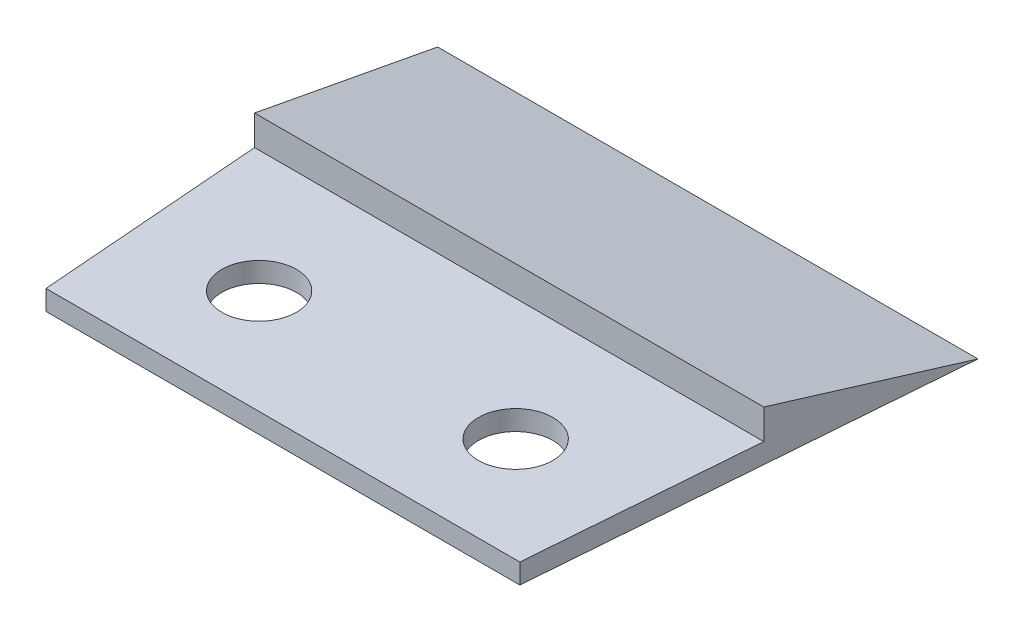
ISO-10303-21;
HEADER;
FILE_DESCRIPTION(('STEP AP214'),'2;1');
FILE_NAME('part.step','',(''),(''),'','','');
FILE_SCHEMA(('AUTOMOTIVE_DESIGN { 1 0 10303 214 1 1 1 1 }'));
ENDSEC;
DATA;
#1=APPLICATION_CONTEXT('core data for automotive mechanical design processes');
#2=APPLICATION_PROTOCOL_DEFINITION('international standard','automotive_design',2000,#1);
#3=PRODUCT_CONTEXT('',#1,'mechanical');
#4=PRODUCT('Part','Part','',(#3));
#5=PRODUCT_RELATED_PRODUCT_CATEGORY('part','',(#4));
#6=PRODUCT_DEFINITION_FORMATION('','',#4);
#7=PRODUCT_DEFINITION_CONTEXT('part definition',#1,'design');
#8=PRODUCT_DEFINITION('design','',#6,#7);
#9=PRODUCT_DEFINITION_SHAPE('','',#8);
#10=(LENGTH_UNIT() NAMED_UNIT(*) SI_UNIT(.MILLI.,.METRE.));
#11=(NAMED_UNIT(*) PLANE_ANGLE_UNIT() SI_UNIT($,.RADIAN.));
#12=(NAMED_UNIT(*) SI_UNIT($,.STERADIAN.) SOLID_ANGLE_UNIT());
#13=UNCERTAINTY_MEASURE_WITH_UNIT(LENGTH_MEASURE(1.E-05),#10,'distance_accuracy_value','');
#14=(GEOMETRIC_REPRESENTATION_CONTEXT(3) GLOBAL_UNCERTAINTY_ASSIGNED_CONTEXT((#13)) GLOBAL_UNIT_ASSIGNED_CONTEXT((#10,
#11,#12)) REPRESENTATION_CONTEXT('',''));
#15=CARTESIAN_POINT('',(0.,0.,0.));
#16=DIRECTION('',(0.,0.,1.));
#17=DIRECTION('',(1.,0.,0.));
#18=AXIS2_PLACEMENT_3D('',#15,#16,#17);
#19=CARTESIAN_POINT('',(0.,1.524,0.));
#20=DIRECTION('',(0.,1.,0.));
#21=DIRECTION('',(0.,0.,1.));
#22=AXIS2_PLACEMENT_3D('',#19,#20,#21);
#23=PLANE('',#22);
#24=CARTESIAN_POINT('',(10.1883307692308,1.524,12.4112215384615));
#25=DIRECTION('',(0.,1.,0.));
#26=DIRECTION('',(0.,0.,1.));
#27=AXIS2_PLACEMENT_3D('',#24,#25,#26);
#28=CIRCLE('',#27,2.8448);
#29=CARTESIAN_POINT('',(10.1883307692308,1.524,9.56642153846154));
#30=VERTEX_POINT('',#29);
#31=EDGE_CURVE('E113',#30,#30,#28,.F.);
#32=ORIENTED_EDGE('',*,*,#31,.T.);
#33=EDGE_LOOP('',(#32));
#34=FACE_BOUND('',#33,.T.);
#35=CARTESIAN_POINT('',(-9.39506923076923,1.524,12.4112215384615));
#36=DIRECTION('',(0.,1.,0.));
#37=DIRECTION('',(0.,0.,1.));
#38=AXIS2_PLACEMENT_3D('',#35,#36,#37);
#39=CIRCLE('',#38,2.8448);
#40=CARTESIAN_POINT('',(-9.39506923076923,1.524,9.56642153846154));
#41=VERTEX_POINT('',#40);
#42=EDGE_CURVE('E114',#41,#41,#39,.T.);
#43=ORIENTED_EDGE('',*,*,#42,.F.);
#44=EDGE_LOOP('',(#43));
#45=FACE_BOUND('',#44,.T.);
#46=DIRECTION('',(0.0780695314427082,0.,-0.996947916523384));
#47=VECTOR('',#46,1.);
#48=CARTESIAN_POINT('',(19.9555211295336,1.524,1.56268763739495));
#49=LINE('',#48,#47);
#50=CARTESIAN_POINT('',(18.4814307692308,1.524,20.3868215384615));
#51=VERTEX_POINT('',#50);
#52=CARTESIAN_POINT('',(19.8339757966388,1.524,3.11482153846154));
#53=VERTEX_POINT('',#52);
#54=EDGE_CURVE('E56',#51,#53,#49,.T.);
#55=ORIENTED_EDGE('',*,*,#54,.T.);
#56=DIRECTION('',(-1.,0.,0.));
#57=VECTOR('',#56,1.);
#58=CARTESIAN_POINT('',(29.5856431202425,1.524,3.11482153846154));
#59=LINE('',#58,#57);
#60=CARTESIAN_POINT('',(-19.0407142581772,1.524,3.11482153846154));
#61=VERTEX_POINT('',#60);
#62=EDGE_CURVE('E51',#53,#61,#59,.T.);
#63=ORIENTED_EDGE('',*,*,#62,.T.);
#64=DIRECTION('',(-0.0780695314427085,0.,-0.996947916523384));
#65=VECTOR('',#64,1.);
#66=CARTESIAN_POINT('',(-19.1670944025397,1.524,1.50094709495222));
#67=LINE('',#66,#65);
#68=CARTESIAN_POINT('',(-17.6881692307692,1.524,20.3868215384615));
#69=VERTEX_POINT('',#68);
#70=EDGE_CURVE('E118',#69,#61,#67,.T.);
#71=ORIENTED_EDGE('',*,*,#70,.F.);
#72=DIRECTION('',(1.,0.,0.));
#73=VECTOR('',#72,1.);
#74=CARTESIAN_POINT('',(0.,1.524,20.3868215384615));
#75=LINE('',#74,#73);
#76=EDGE_CURVE('E142',#69,#51,#75,.T.);
#77=ORIENTED_EDGE('',*,*,#76,.T.);
#78=EDGE_LOOP('',(#55,#63,#71,#77));
#79=FACE_BOUND('',#78,.T.);
#80=ADVANCED_FACE('F36',(#34,#45,#79),#23,.T.);
#81=CARTESIAN_POINT('',(0.,1.524,20.3868215384615));
#82=DIRECTION('',(0.,0.,-1.));
#83=DIRECTION('',(-1.,0.,0.));
#84=AXIS2_PLACEMENT_3D('',#81,#82,#83);
#85=PLANE('',#84);
#86=DIRECTION('',(1.,0.,0.));
#87=VECTOR('',#86,1.);
#88=CARTESIAN_POINT('',(0.,0.,20.3868215384615));
#89=LINE('',#88,#87);
#90=CARTESIAN_POINT('',(-17.6881692307692,0.,20.3868215384615));
#91=VERTEX_POINT('',#90);
#92=CARTESIAN_POINT('',(18.4814307692308,0.,20.3868215384615));
#93=VERTEX_POINT('',#92);
#94=EDGE_CURVE('E101',#91,#93,#89,.T.);
#95=ORIENTED_EDGE('',*,*,#94,.T.);
#96=DIRECTION('',(0.,-1.,0.));
#97=VECTOR('',#96,1.);
#98=CARTESIAN_POINT('',(18.4814307692308,1.524,20.3868215384615));
#99=LINE('',#98,#97);
#100=EDGE_CURVE('E12',#51,#93,#99,.T.);
#101=ORIENTED_EDGE('',*,*,#100,.F.);
#102=ORIENTED_EDGE('',*,*,#76,.F.);
#103=DIRECTION('',(0.,-1.,0.));
#104=VECTOR('',#103,1.);
#105=CARTESIAN_POINT('',(-17.6881692307692,1.524,20.3868215384615));
#106=LINE('',#105,#104);
#107=EDGE_CURVE('E44',#69,#91,#106,.T.);
#108=ORIENTED_EDGE('',*,*,#107,.T.);
#109=EDGE_LOOP('',(#95,#101,#102,#108));
#110=FACE_BOUND('',#109,.T.);
#111=ADVANCED_FACE('F127',(#110),#85,.F.);
#112=CARTESIAN_POINT('',(19.9555211295336,1.524,1.56268763739495));
#113=DIRECTION('',(-0.996947916523384,0.,-0.0780695314427082));
#114=DIRECTION('',(-0.0780695314427082,0.,0.996947916523384));
#115=AXIS2_PLACEMENT_3D('',#112,#113,#114);
#116=PLANE('',#115);
#117=DIRECTION('',(0.0780695314427082,0.,-0.996947916523384));
#118=VECTOR('',#117,1.);
#119=CARTESIAN_POINT('',(19.9555211295336,0.,1.56268763739495));
#120=LINE('',#119,#118);
#121=CARTESIAN_POINT('',(21.0214307692308,0.,-12.0489784615385));
#122=VERTEX_POINT('',#121);
#123=EDGE_CURVE('E95',#93,#122,#120,.T.);
#124=ORIENTED_EDGE('',*,*,#123,.T.);
#125=DIRECTION('',(-0.075729841403592,0.242982430835143,0.96707007472387));
#126=VECTOR('',#125,1.);
#127=CARTESIAN_POINT('',(20.1881268527719,2.67369120934177,-1.40768744835823));
#128=LINE('',#127,#126);
#129=CARTESIAN_POINT('',(19.8339757966388,3.81,3.11482153846154));
#130=VERTEX_POINT('',#129);
#131=EDGE_CURVE('E83',#122,#130,#128,.T.);
#132=ORIENTED_EDGE('',*,*,#131,.T.);
#133=DIRECTION('',(0.,-1.,0.));
#134=VECTOR('',#133,1.);
#135=CARTESIAN_POINT('',(19.8339757966388,0.,3.11482153846154));
#136=LINE('',#135,#134);
#137=EDGE_CURVE('E93',#130,#53,#136,.T.);
#138=ORIENTED_EDGE('',*,*,#137,.T.);
#139=ORIENTED_EDGE('',*,*,#54,.F.);
#140=ORIENTED_EDGE('',*,*,#100,.T.);
#141=EDGE_LOOP('',(#124,#132,#138,#139,#140));
#142=FACE_BOUND('',#141,.T.);
#143=ADVANCED_FACE('F96',(#142),#116,.F.);
#144=CARTESIAN_POINT('',(-19.1670944025397,1.524,1.50094709495222));
#145=DIRECTION('',(-0.996947916523384,0.,0.0780695314427085));
#146=DIRECTION('',(0.0780695314427085,0.,0.996947916523384));
#147=AXIS2_PLACEMENT_3D('',#144,#145,#146);
#148=PLANE('',#147);
#149=DIRECTION('',(-0.0757298414035922,-0.242982430835143,-0.96707007472387));
#150=VECTOR('',#149,1.);
#151=CARTESIAN_POINT('',(-19.3948653143103,2.67369120934177,-1.40768744835823));
#152=LINE('',#151,#150);
#153=CARTESIAN_POINT('',(-19.0407142581772,3.81,3.11482153846154));
#154=VERTEX_POINT('',#153);
#155=CARTESIAN_POINT('',(-20.2281692307692,0.,-12.0489784615385));
#156=VERTEX_POINT('',#155);
#157=EDGE_CURVE('E131',#154,#156,#152,.T.);
#158=ORIENTED_EDGE('',*,*,#157,.T.);
#159=DIRECTION('',(-0.0780695314427085,0.,-0.996947916523384));
#160=VECTOR('',#159,1.);
#161=CARTESIAN_POINT('',(-19.1670944025397,0.,1.50094709495222));
#162=LINE('',#161,#160);
#163=EDGE_CURVE('E106',#91,#156,#162,.T.);
#164=ORIENTED_EDGE('',*,*,#163,.F.);
#165=ORIENTED_EDGE('',*,*,#107,.F.);
#166=ORIENTED_EDGE('',*,*,#70,.T.);
#167=DIRECTION('',(0.,1.,0.));
#168=VECTOR('',#167,1.);
#169=CARTESIAN_POINT('',(-19.0407142581772,0.,3.11482153846154));
#170=LINE('',#169,#168);
#171=EDGE_CURVE('E133',#61,#154,#170,.T.);
#172=ORIENTED_EDGE('',*,*,#171,.T.);
#173=EDGE_LOOP('',(#158,#164,#165,#166,#172));
#174=FACE_BOUND('',#173,.T.);
#175=ADVANCED_FACE('F129',(#174),#148,.T.);
#176=CARTESIAN_POINT('',(10.1883307692308,1.524,12.4112215384615));
#177=DIRECTION('',(0.,-1.,0.));
#178=DIRECTION('',(0.,0.,-1.));
#179=AXIS2_PLACEMENT_3D('',#176,#177,#178);
#180=CYLINDRICAL_SURFACE('',#179,2.8448);
#181=CARTESIAN_POINT('',(10.1883307692308,0.,12.4112215384615));
#182=DIRECTION('',(0.,1.,0.));
#183=DIRECTION('',(0.,0.,1.));
#184=AXIS2_PLACEMENT_3D('',#181,#182,#183);
#185=CIRCLE('',#184,2.8448);
#186=CARTESIAN_POINT('',(10.1883307692308,0.,9.56642153846154));
#187=VERTEX_POINT('',#186);
#188=EDGE_CURVE('E125',#187,#187,#185,.F.);
#189=CARTESIAN_POINT('',(10.1883307692308,1.524,9.56642153846154));
#190=CARTESIAN_POINT('',(10.1883307692308,1.508125,9.56642153846154));
#191=CARTESIAN_POINT('',(10.1883307692308,1.49225,9.56642153846154));
#192=CARTESIAN_POINT('',(10.1883307692308,1.4605,9.56642153846154));
#193=CARTESIAN_POINT('',(10.1883307692308,1.444625,9.56642153846154));
#194=CARTESIAN_POINT('',(10.1883307692308,1.412875,9.56642153846154));
#195=CARTESIAN_POINT('',(10.1883307692308,1.397,9.56642153846154));
#196=CARTESIAN_POINT('',(10.1883307692308,1.36525,9.56642153846154));
#197=CARTESIAN_POINT('',(10.1883307692308,1.349375,9.56642153846154));
#198=CARTESIAN_POINT('',(10.1883307692308,1.317625,9.56642153846154));
#199=CARTESIAN_POINT('',(10.1883307692308,1.30175,9.56642153846154));
#200=CARTESIAN_POINT('',(10.1883307692308,1.27,9.56642153846154));
#201=CARTESIAN_POINT('',(10.1883307692308,1.254125,9.56642153846154));
#202=CARTESIAN_POINT('',(10.1883307692308,1.222375,9.56642153846154));
#203=CARTESIAN_POINT('',(10.1883307692308,1.2065,9.56642153846154));
#204=CARTESIAN_POINT('',(10.1883307692308,1.17475,9.56642153846154));
#205=CARTESIAN_POINT('',(10.1883307692308,1.158875,9.56642153846154));
#206=CARTESIAN_POINT('',(10.1883307692308,1.127125,9.56642153846154));
#207=CARTESIAN_POINT('',(10.1883307692308,1.11125,9.56642153846154));
#208=CARTESIAN_POINT('',(10.1883307692308,1.0795,9.56642153846154));
#209=CARTESIAN_POINT('',(10.1883307692308,1.063625,9.56642153846154));
#210=CARTESIAN_POINT('',(10.1883307692308,1.031875,9.56642153846154));
#211=CARTESIAN_POINT('',(10.1883307692308,1.016,9.56642153846154));
#212=CARTESIAN_POINT('',(10.1883307692308,0.98425,9.56642153846154));
#213=CARTESIAN_POINT('',(10.1883307692308,0.968375,9.56642153846154));
#214=CARTESIAN_POINT('',(10.1883307692308,0.936625,9.56642153846154));
#215=CARTESIAN_POINT('',(10.1883307692308,0.92075,9.56642153846154));
#216=CARTESIAN_POINT('',(10.1883307692308,0.889,9.56642153846154));
#217=CARTESIAN_POINT('',(10.1883307692308,0.873125,9.56642153846154));
#218=CARTESIAN_POINT('',(10.1883307692308,0.841375,9.56642153846154));
#219=CARTESIAN_POINT('',(10.1883307692308,0.8255,9.56642153846154));
#220=CARTESIAN_POINT('',(10.1883307692308,0.79375,9.56642153846154));
#221=CARTESIAN_POINT('',(10.1883307692308,0.777875,9.56642153846154));
#222=CARTESIAN_POINT('',(10.1883307692308,0.746125,9.56642153846154));
#223=CARTESIAN_POINT('',(10.1883307692308,0.73025,9.56642153846154));
#224=CARTESIAN_POINT('',(10.1883307692308,0.6985,9.56642153846154));
#225=CARTESIAN_POINT('',(10.1883307692308,0.682625,9.56642153846154));
#226=CARTESIAN_POINT('',(10.1883307692308,0.650875,9.56642153846154));
#227=CARTESIAN_POINT('',(10.1883307692308,0.635,9.56642153846154));
#228=CARTESIAN_POINT('',(10.1883307692308,0.60325,9.56642153846154));
#229=CARTESIAN_POINT('',(10.1883307692308,0.587375,9.56642153846154));
#230=CARTESIAN_POINT('',(10.1883307692308,0.555625,9.56642153846154));
#231=CARTESIAN_POINT('',(10.1883307692308,0.53975,9.56642153846154));
#232=CARTESIAN_POINT('',(10.1883307692308,0.508,9.56642153846154));
#233=CARTESIAN_POINT('',(10.1883307692308,0.492125,9.56642153846154));
#234=CARTESIAN_POINT('',(10.1883307692308,0.460375,9.56642153846154));
#235=CARTESIAN_POINT('',(10.1883307692308,0.4445,9.56642153846154));
#236=CARTESIAN_POINT('',(10.1883307692308,0.41275,9.56642153846154));
#237=CARTESIAN_POINT('',(10.1883307692308,0.396875,9.56642153846154));
#238=CARTESIAN_POINT('',(10.1883307692308,0.365125,9.56642153846154));
#239=CARTESIAN_POINT('',(10.1883307692308,0.34925,9.56642153846154));
#240=CARTESIAN_POINT('',(10.1883307692308,0.3175,9.56642153846154));
#241=CARTESIAN_POINT('',(10.1883307692308,0.301625,9.56642153846154));
#242=CARTESIAN_POINT('',(10.1883307692308,0.269875,9.56642153846154));
#243=CARTESIAN_POINT('',(10.1883307692308,0.254,9.56642153846154));
#244=CARTESIAN_POINT('',(10.1883307692308,0.22225,9.56642153846154));
#245=CARTESIAN_POINT('',(10.1883307692308,0.206375,9.56642153846154));
#246=CARTESIAN_POINT('',(10.1883307692308,0.174625,9.56642153846154));
#247=CARTESIAN_POINT('',(10.1883307692308,0.15875,9.56642153846154));
#248=CARTESIAN_POINT('',(10.1883307692308,0.127,9.56642153846154));
#249=CARTESIAN_POINT('',(10.1883307692308,0.111125,9.56642153846154));
#250=CARTESIAN_POINT('',(10.1883307692308,0.079375,9.56642153846154));
#251=CARTESIAN_POINT('',(10.1883307692308,0.0635,9.56642153846154));
#252=CARTESIAN_POINT('',(10.1883307692308,0.0317499999999999,9.56642153846154));
#253=CARTESIAN_POINT('',(10.1883307692308,0.015875,9.56642153846154));
#254=CARTESIAN_POINT('',(10.1883307692308,0.,9.56642153846154));
#255=B_SPLINE_CURVE_WITH_KNOTS('',3,(#189,#190,#191,#192,#193,#194,#195,#196,#197,#198,#199,
#200,#201,#202,#203,#204,#205,#206,#207,#208,#209,#210,#211,#212,#213,#214,#215,#216,#217,#218,
#219,#220,#221,#222,#223,#224,#225,#226,#227,#228,#229,#230,#231,#232,#233,#234,#235,#236,#237,
#238,#239,#240,#241,#242,#243,#244,#245,#246,#247,#248,#249,#250,#251,#252,#253,#254),
.UNSPECIFIED.,.F.,.F.,(4,2,2,2,2,2,2,2,2,2,2,2,2,2,2,2,2,2,2,2,2,2,2,2,2,2,2,2,2,2,2,2,4),(0.,
0.0476250000000001,0.0952500000000001,0.142875,0.1905,0.238125,0.28575,0.333375,0.381,0.428625,
0.47625,0.523875,0.5715,0.619125,0.66675,0.714375,0.762,0.809625,0.85725,0.904875,0.9525,
1.000125,1.04775,1.095375,1.143,1.190625,1.23825,1.285875,1.3335,1.381125,1.42875,1.476375,
1.524),.UNSPECIFIED.);
#256=EDGE_CURVE('BSEAM38',#30,#187,#255,.T.);
#257=ORIENTED_EDGE('',*,*,#31,.F.);
#258=ORIENTED_EDGE('',*,*,#188,.T.);
#259=ORIENTED_EDGE('',*,*,#256,.T.);
#260=ORIENTED_EDGE('',*,*,#256,.F.);
#261=EDGE_LOOP('',(#257,#259,#258,#260));
#262=FACE_BOUND('',#261,.T.);
#263=ADVANCED_FACE('F38',(#262),#180,.F.);
#264=CARTESIAN_POINT('',(-9.39506923076923,1.524,12.4112215384615));
#265=DIRECTION('',(0.,-1.,0.));
#266=DIRECTION('',(0.,0.,-1.));
#267=AXIS2_PLACEMENT_3D('',#264,#265,#266);
#268=CYLINDRICAL_SURFACE('',#267,2.8448);
#269=CARTESIAN_POINT('',(-9.39506923076923,0.,12.4112215384615));
#270=DIRECTION('',(0.,1.,0.));
#271=DIRECTION('',(0.,0.,1.));
#272=AXIS2_PLACEMENT_3D('',#269,#270,#271);
#273=CIRCLE('',#272,2.8448);
#274=CARTESIAN_POINT('',(-9.39506923076923,0.,9.56642153846154));
#275=VERTEX_POINT('',#274);
#276=EDGE_CURVE('E108',#275,#275,#273,.T.);
#277=CARTESIAN_POINT('',(-9.39506923076923,1.524,9.56642153846154));
#278=CARTESIAN_POINT('',(-9.39506923076923,1.508125,9.56642153846154));
#279=CARTESIAN_POINT('',(-9.39506923076923,1.49225,9.56642153846154));
#280=CARTESIAN_POINT('',(-9.39506923076923,1.4605,9.56642153846154));
#281=CARTESIAN_POINT('',(-9.39506923076923,1.444625,9.56642153846154));
#282=CARTESIAN_POINT('',(-9.39506923076923,1.412875,9.56642153846154));
#283=CARTESIAN_POINT('',(-9.39506923076923,1.397,9.56642153846154));
#284=CARTESIAN_POINT('',(-9.39506923076923,1.36525,9.56642153846154));
#285=CARTESIAN_POINT('',(-9.39506923076923,1.349375,9.56642153846154));
#286=CARTESIAN_POINT('',(-9.39506923076923,1.317625,9.56642153846154));
#287=CARTESIAN_POINT('',(-9.39506923076923,1.30175,9.56642153846154));
#288=CARTESIAN_POINT('',(-9.39506923076923,1.27,9.56642153846154));
#289=CARTESIAN_POINT('',(-9.39506923076923,1.254125,9.56642153846154));
#290=CARTESIAN_POINT('',(-9.39506923076923,1.222375,9.56642153846154));
#291=CARTESIAN_POINT('',(-9.39506923076923,1.2065,9.56642153846154));
#292=CARTESIAN_POINT('',(-9.39506923076923,1.17475,9.56642153846154));
#293=CARTESIAN_POINT('',(-9.39506923076923,1.158875,9.56642153846154));
#294=CARTESIAN_POINT('',(-9.39506923076923,1.127125,9.56642153846154));
#295=CARTESIAN_POINT('',(-9.39506923076923,1.11125,9.56642153846154));
#296=CARTESIAN_POINT('',(-9.39506923076923,1.0795,9.56642153846154));
#297=CARTESIAN_POINT('',(-9.39506923076923,1.063625,9.56642153846154));
#298=CARTESIAN_POINT('',(-9.39506923076923,1.031875,9.56642153846154));
#299=CARTESIAN_POINT('',(-9.39506923076923,1.016,9.56642153846154));
#300=CARTESIAN_POINT('',(-9.39506923076923,0.98425,9.56642153846154));
#301=CARTESIAN_POINT('',(-9.39506923076923,0.968375,9.56642153846154));
#302=CARTESIAN_POINT('',(-9.39506923076923,0.936625,9.56642153846154));
#303=CARTESIAN_POINT('',(-9.39506923076923,0.92075,9.56642153846154));
#304=CARTESIAN_POINT('',(-9.39506923076923,0.889,9.56642153846154));
#305=CARTESIAN_POINT('',(-9.39506923076923,0.873125,9.56642153846154));
#306=CARTESIAN_POINT('',(-9.39506923076923,0.841375,9.56642153846154));
#307=CARTESIAN_POINT('',(-9.39506923076923,0.8255,9.56642153846154));
#308=CARTESIAN_POINT('',(-9.39506923076923,0.79375,9.56642153846154));
#309=CARTESIAN_POINT('',(-9.39506923076923,0.777875,9.56642153846154));
#310=CARTESIAN_POINT('',(-9.39506923076923,0.746125,9.56642153846154));
#311=CARTESIAN_POINT('',(-9.39506923076923,0.73025,9.56642153846154));
#312=CARTESIAN_POINT('',(-9.39506923076923,0.6985,9.56642153846154));
#313=CARTESIAN_POINT('',(-9.39506923076923,0.682625,9.56642153846154));
#314=CARTESIAN_POINT('',(-9.39506923076923,0.650875,9.56642153846154));
#315=CARTESIAN_POINT('',(-9.39506923076923,0.635,9.56642153846154));
#316=CARTESIAN_POINT('',(-9.39506923076923,0.60325,9.56642153846154));
#317=CARTESIAN_POINT('',(-9.39506923076923,0.587375,9.56642153846154));
#318=CARTESIAN_POINT('',(-9.39506923076923,0.555625,9.56642153846154));
#319=CARTESIAN_POINT('',(-9.39506923076923,0.53975,9.56642153846154));
#320=CARTESIAN_POINT('',(-9.39506923076923,0.508,9.56642153846154));
#321=CARTESIAN_POINT('',(-9.39506923076923,0.492125,9.56642153846154));
#322=CARTESIAN_POINT('',(-9.39506923076923,0.460375,9.56642153846154));
#323=CARTESIAN_POINT('',(-9.39506923076923,0.4445,9.56642153846154));
#324=CARTESIAN_POINT('',(-9.39506923076923,0.41275,9.56642153846154));
#325=CARTESIAN_POINT('',(-9.39506923076923,0.396875,9.56642153846154));
#326=CARTESIAN_POINT('',(-9.39506923076923,0.365125,9.56642153846154));
#327=CARTESIAN_POINT('',(-9.39506923076923,0.34925,9.56642153846154));
#328=CARTESIAN_POINT('',(-9.39506923076923,0.3175,9.56642153846154));
#329=CARTESIAN_POINT('',(-9.39506923076923,0.301625,9.56642153846154));
#330=CARTESIAN_POINT('',(-9.39506923076923,0.269875,9.56642153846154));
#331=CARTESIAN_POINT('',(-9.39506923076923,0.254,9.56642153846154));
#332=CARTESIAN_POINT('',(-9.39506923076923,0.22225,9.56642153846154));
#333=CARTESIAN_POINT('',(-9.39506923076923,0.206375,9.56642153846154));
#334=CARTESIAN_POINT('',(-9.39506923076923,0.174625,9.56642153846154));
#335=CARTESIAN_POINT('',(-9.39506923076923,0.15875,9.56642153846154));
#336=CARTESIAN_POINT('',(-9.39506923076923,0.127,9.56642153846154));
#337=CARTESIAN_POINT('',(-9.39506923076923,0.111125,9.56642153846154));
#338=CARTESIAN_POINT('',(-9.39506923076923,0.079375,9.56642153846154));
#339=CARTESIAN_POINT('',(-9.39506923076923,0.0635,9.56642153846154));
#340=CARTESIAN_POINT('',(-9.39506923076923,0.0317499999999999,9.56642153846154));
#341=CARTESIAN_POINT('',(-9.39506923076923,0.015875,9.56642153846154));
#342=CARTESIAN_POINT('',(-9.39506923076923,0.,9.56642153846154));
#343=B_SPLINE_CURVE_WITH_KNOTS('',3,(#277,#278,#279,#280,#281,#282,#283,#284,#285,#286,#287,
#288,#289,#290,#291,#292,#293,#294,#295,#296,#297,#298,#299,#300,#301,#302,#303,#304,#305,#306,
#307,#308,#309,#310,#311,#312,#313,#314,#315,#316,#317,#318,#319,#320,#321,#322,#323,#324,#325,
#326,#327,#328,#329,#330,#331,#332,#333,#334,#335,#336,#337,#338,#339,#340,#341,#342),
.UNSPECIFIED.,.F.,.F.,(4,2,2,2,2,2,2,2,2,2,2,2,2,2,2,2,2,2,2,2,2,2,2,2,2,2,2,2,2,2,2,2,4),(0.,
0.0476250000000001,0.0952500000000001,0.142875,0.1905,0.238125,0.28575,0.333375,0.381,0.428625,
0.47625,0.523875,0.5715,0.619125,0.66675,0.714375,0.762,0.809625,0.85725,0.904875,0.9525,
1.000125,1.04775,1.095375,1.143,1.190625,1.23825,1.285875,1.3335,1.381125,1.42875,1.476375,
1.524),.UNSPECIFIED.);
#344=EDGE_CURVE('BSEAM161',#41,#275,#343,.T.);
#345=ORIENTED_EDGE('',*,*,#42,.T.);
#346=ORIENTED_EDGE('',*,*,#276,.F.);
#347=ORIENTED_EDGE('',*,*,#344,.T.);
#348=ORIENTED_EDGE('',*,*,#344,.F.);
#349=EDGE_LOOP('',(#345,#347,#346,#348));
#350=FACE_BOUND('',#349,.T.);
#351=ADVANCED_FACE('F161',(#350),#268,.F.);
#352=CARTESIAN_POINT('',(0.,0.,0.));
#353=DIRECTION('',(0.,1.,0.));
#354=DIRECTION('',(0.,0.,1.));
#355=AXIS2_PLACEMENT_3D('',#352,#353,#354);
#356=PLANE('',#355);
#357=ORIENTED_EDGE('',*,*,#188,.F.);
#358=EDGE_LOOP('',(#357));
#359=FACE_BOUND('',#358,.T.);
#360=ORIENTED_EDGE('',*,*,#94,.F.);
#361=ORIENTED_EDGE('',*,*,#163,.T.);
#362=DIRECTION('',(1.,0.,0.));
#363=VECTOR('',#362,1.);
#364=CARTESIAN_POINT('',(0.,0.,-12.0489784615385));
#365=LINE('',#364,#363);
#366=EDGE_CURVE('E88',#156,#122,#365,.T.);
#367=ORIENTED_EDGE('',*,*,#366,.T.);
#368=ORIENTED_EDGE('',*,*,#123,.F.);
#369=EDGE_LOOP('',(#360,#361,#367,#368));
#370=FACE_BOUND('',#369,.T.);
#371=ORIENTED_EDGE('',*,*,#276,.T.);
#372=EDGE_LOOP('',(#371));
#373=FACE_BOUND('',#372,.T.);
#374=ADVANCED_FACE('F103',(#359,#370,#373),#356,.F.);
#375=CARTESIAN_POINT('',(29.5856431202425,2.84761254346233,-0.715480538558378));
#376=DIRECTION('',(0.,0.969855137467705,-0.243682195343645));
#377=DIRECTION('',(0.,0.243682195343645,0.969855137467706));
#378=AXIS2_PLACEMENT_3D('',#375,#376,#377);
#379=PLANE('',#378);
#380=ORIENTED_EDGE('',*,*,#131,.F.);
#381=ORIENTED_EDGE('',*,*,#366,.F.);
#382=ORIENTED_EDGE('',*,*,#157,.F.);
#383=DIRECTION('',(-1.,0.,0.));
#384=VECTOR('',#383,1.);
#385=CARTESIAN_POINT('',(29.5856431202425,3.81,3.11482153846154));
#386=LINE('',#385,#384);
#387=EDGE_CURVE('E90',#130,#154,#386,.T.);
#388=ORIENTED_EDGE('',*,*,#387,.F.);
#389=EDGE_LOOP('',(#380,#381,#382,#388));
#390=FACE_BOUND('',#389,.T.);
#391=ADVANCED_FACE('F85',(#390),#379,.T.);
#392=CARTESIAN_POINT('',(29.5856431202425,0.,3.11482153846154));
#393=DIRECTION('',(0.,0.,1.));
#394=DIRECTION('',(1.,0.,0.));
#395=AXIS2_PLACEMENT_3D('',#392,#393,#394);
#396=PLANE('',#395);
#397=ORIENTED_EDGE('',*,*,#137,.F.);
#398=ORIENTED_EDGE('',*,*,#387,.T.);
#399=ORIENTED_EDGE('',*,*,#171,.F.);
#400=ORIENTED_EDGE('',*,*,#62,.F.);
#401=EDGE_LOOP('',(#397,#398,#399,#400));
#402=FACE_BOUND('',#401,.T.);
#403=ADVANCED_FACE('F144',(#402),#396,.T.);
#404=CLOSED_SHELL('',(#80,#111,#143,#175,#263,#351,#374,#391,#403));
#405=MANIFOLD_SOLID_BREP('B2',#404);
#406=ADVANCED_BREP_SHAPE_REPRESENTATION('',(#18,#405),#14);
#407=SHAPE_DEFINITION_REPRESENTATION(#9,#406);
ENDSEC;
END-ISO-10303-21;
